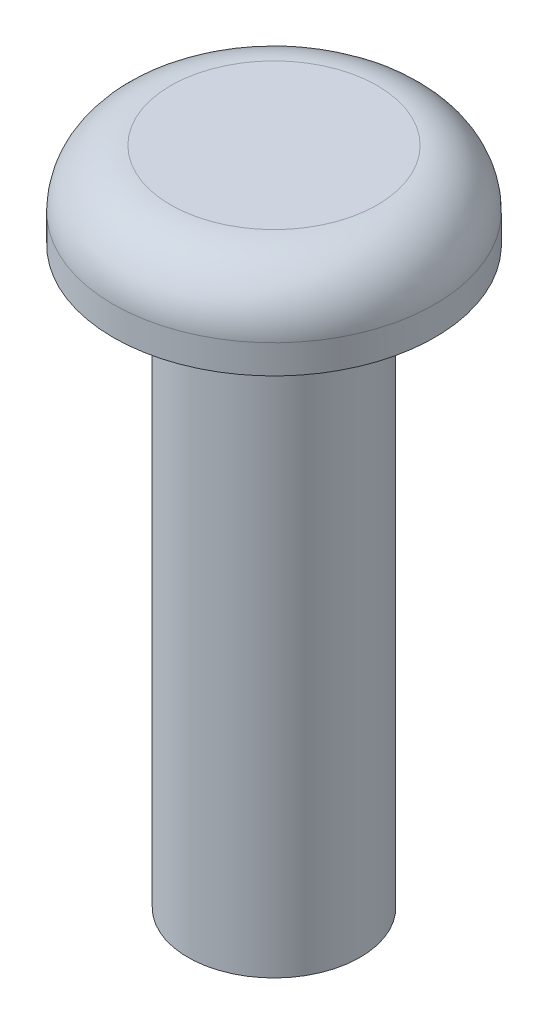
ISO-10303-21;
HEADER;
FILE_DESCRIPTION(('STEP AP214'),'2;1');
FILE_NAME('part.step','',(''),(''),'','','');
FILE_SCHEMA(('AUTOMOTIVE_DESIGN { 1 0 10303 214 1 1 1 1 }'));
ENDSEC;
DATA;
#1=APPLICATION_CONTEXT('core data for automotive mechanical design processes');
#2=APPLICATION_PROTOCOL_DEFINITION('international standard','automotive_design',2000,#1);
#3=PRODUCT_CONTEXT('',#1,'mechanical');
#4=PRODUCT('Part','Part','',(#3));
#5=PRODUCT_RELATED_PRODUCT_CATEGORY('part','',(#4));
#6=PRODUCT_DEFINITION_FORMATION('','',#4);
#7=PRODUCT_DEFINITION_CONTEXT('part definition',#1,'design');
#8=PRODUCT_DEFINITION('design','',#6,#7);
#9=PRODUCT_DEFINITION_SHAPE('','',#8);
#10=(LENGTH_UNIT() NAMED_UNIT(*) SI_UNIT(.MILLI.,.METRE.));
#11=(NAMED_UNIT(*) PLANE_ANGLE_UNIT() SI_UNIT($,.RADIAN.));
#12=(NAMED_UNIT(*) SI_UNIT($,.STERADIAN.) SOLID_ANGLE_UNIT());
#13=UNCERTAINTY_MEASURE_WITH_UNIT(LENGTH_MEASURE(1.E-05),#10,'distance_accuracy_value','');
#14=(GEOMETRIC_REPRESENTATION_CONTEXT(3) GLOBAL_UNCERTAINTY_ASSIGNED_CONTEXT((#13)) GLOBAL_UNIT_ASSIGNED_CONTEXT((#10,
#11,#12)) REPRESENTATION_CONTEXT('',''));
#15=CARTESIAN_POINT('',(0.,0.,0.));
#16=DIRECTION('',(0.,0.,1.));
#17=DIRECTION('',(1.,0.,0.));
#18=AXIS2_PLACEMENT_3D('',#15,#16,#17);
#19=CARTESIAN_POINT('',(0.,1.5,0.));
#20=DIRECTION('',(0.,-1.,0.));
#21=DIRECTION('',(0.,0.,-1.));
#22=AXIS2_PLACEMENT_3D('',#19,#20,#21);
#23=CYLINDRICAL_SURFACE('',#22,2.8);
#24=CARTESIAN_POINT('',(0.,0.5,0.));
#25=DIRECTION('',(0.,1.,0.));
#26=DIRECTION('',(0.,0.,1.));
#27=AXIS2_PLACEMENT_3D('',#24,#25,#26);
#28=CIRCLE('',#27,2.8);
#29=CARTESIAN_POINT('',(0.,0.5,2.8));
#30=VERTEX_POINT('',#29);
#31=EDGE_CURVE('E35',#30,#30,#28,.F.);
#32=ORIENTED_EDGE('',*,*,#31,.T.);
#33=EDGE_LOOP('',(#32));
#34=FACE_BOUND('',#33,.T.);
#35=CARTESIAN_POINT('',(0.,0.,0.));
#36=DIRECTION('',(0.,1.,0.));
#37=DIRECTION('',(0.,0.,1.));
#38=AXIS2_PLACEMENT_3D('',#35,#36,#37);
#39=CIRCLE('',#38,2.8);
#40=CARTESIAN_POINT('',(0.,0.,2.8));
#41=VERTEX_POINT('',#40);
#42=EDGE_CURVE('E47',#41,#41,#39,.T.);
#43=ORIENTED_EDGE('',*,*,#42,.T.);
#44=EDGE_LOOP('',(#43));
#45=FACE_BOUND('',#44,.T.);
#46=ADVANCED_FACE('F31',(#34,#45),#23,.T.);
#47=CARTESIAN_POINT('',(0.,1.5,0.));
#48=DIRECTION('',(0.,1.,0.));
#49=DIRECTION('',(0.,0.,1.));
#50=AXIS2_PLACEMENT_3D('',#47,#48,#49);
#51=PLANE('',#50);
#52=CARTESIAN_POINT('',(0.,1.5,0.));
#53=DIRECTION('',(0.,1.,0.));
#54=DIRECTION('',(0.,0.,1.));
#55=AXIS2_PLACEMENT_3D('',#52,#53,#54);
#56=CIRCLE('',#55,1.8);
#57=CARTESIAN_POINT('',(0.,1.5,1.8));
#58=VERTEX_POINT('',#57);
#59=EDGE_CURVE('E43',#58,#58,#56,.T.);
#60=ORIENTED_EDGE('',*,*,#59,.T.);
#61=EDGE_LOOP('',(#60));
#62=FACE_BOUND('',#61,.T.);
#63=ADVANCED_FACE('F52',(#62),#51,.T.);
#64=CARTESIAN_POINT('',(0.,0.,0.));
#65=DIRECTION('',(0.,1.,0.));
#66=DIRECTION('',(0.,0.,1.));
#67=AXIS2_PLACEMENT_3D('',#64,#65,#66);
#68=PLANE('',#67);
#69=CARTESIAN_POINT('',(0.,0.,0.));
#70=DIRECTION('',(0.,-1.,0.));
#71=DIRECTION('',(0.,0.,-1.));
#72=AXIS2_PLACEMENT_3D('',#69,#70,#71);
#73=CIRCLE('',#72,1.5);
#74=CARTESIAN_POINT('',(0.,0.,-1.5));
#75=VERTEX_POINT('',#74);
#76=EDGE_CURVE('E10',#75,#75,#73,.T.);
#77=ORIENTED_EDGE('',*,*,#76,.F.);
#78=EDGE_LOOP('',(#77));
#79=FACE_BOUND('',#78,.T.);
#80=ORIENTED_EDGE('',*,*,#42,.F.);
#81=EDGE_LOOP('',(#80));
#82=FACE_BOUND('',#81,.T.);
#83=ADVANCED_FACE('F56',(#79,#82),#68,.F.);
#84=CARTESIAN_POINT('',(0.,0.5,0.));
#85=DIRECTION('',(0.,1.,0.));
#86=DIRECTION('',(0.,0.,1.));
#87=AXIS2_PLACEMENT_3D('',#84,#85,#86);
#88=TOROIDAL_SURFACE('',#87,1.8,1.);
#89=ORIENTED_EDGE('',*,*,#31,.F.);
#90=EDGE_LOOP('',(#89));
#91=FACE_BOUND('',#90,.T.);
#92=ORIENTED_EDGE('',*,*,#59,.F.);
#93=EDGE_LOOP('',(#92));
#94=FACE_BOUND('',#93,.T.);
#95=ADVANCED_FACE('F33',(#91,#94),#88,.T.);
#96=CARTESIAN_POINT('',(0.,-10.,0.));
#97=DIRECTION('',(0.,1.,0.));
#98=DIRECTION('',(0.,0.,1.));
#99=AXIS2_PLACEMENT_3D('',#96,#97,#98);
#100=CYLINDRICAL_SURFACE('',#99,1.5);
#101=CARTESIAN_POINT('',(0.,-10.,0.));
#102=DIRECTION('',(0.,-1.,0.));
#103=DIRECTION('',(0.,0.,-1.));
#104=AXIS2_PLACEMENT_3D('',#101,#102,#103);
#105=CIRCLE('',#104,1.5);
#106=CARTESIAN_POINT('',(0.,-10.,-1.5));
#107=VERTEX_POINT('',#106);
#108=EDGE_CURVE('E46',#107,#107,#105,.T.);
#109=ORIENTED_EDGE('',*,*,#108,.F.);
#110=EDGE_LOOP('',(#109));
#111=FACE_BOUND('',#110,.T.);
#112=ORIENTED_EDGE('',*,*,#76,.T.);
#113=EDGE_LOOP('',(#112));
#114=FACE_BOUND('',#113,.T.);
#115=ADVANCED_FACE('F55',(#111,#114),#100,.T.);
#116=CARTESIAN_POINT('',(0.,-10.,0.));
#117=DIRECTION('',(0.,-1.,0.));
#118=DIRECTION('',(0.,0.,-1.));
#119=AXIS2_PLACEMENT_3D('',#116,#117,#118);
#120=PLANE('',#119);
#121=ORIENTED_EDGE('',*,*,#108,.T.);
#122=EDGE_LOOP('',(#121));
#123=FACE_BOUND('',#122,.T.);
#124=ADVANCED_FACE('F62',(#123),#120,.T.);
#125=CLOSED_SHELL('',(#46,#63,#83,#95,#115,#124));
#126=MANIFOLD_SOLID_BREP('B2',#125);
#127=ADVANCED_BREP_SHAPE_REPRESENTATION('',(#18,#126),#14);
#128=SHAPE_DEFINITION_REPRESENTATION(#9,#127);
ENDSEC;
END-ISO-10303-21;
